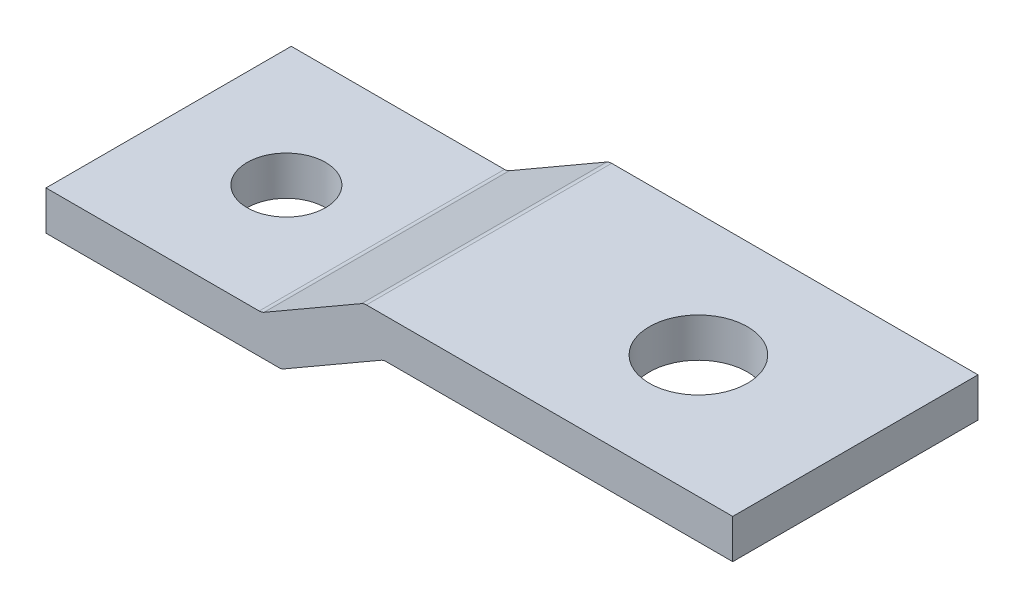
ISO-10303-21;
HEADER;
FILE_DESCRIPTION(('STEP AP214'),'2;1');
FILE_NAME('part.step','',(''),(''),'','','');
FILE_SCHEMA(('AUTOMOTIVE_DESIGN { 1 0 10303 214 1 1 1 1 }'));
ENDSEC;
DATA;
#1=APPLICATION_CONTEXT('core data for automotive mechanical design processes');
#2=APPLICATION_PROTOCOL_DEFINITION('international standard','automotive_design',2000,#1);
#3=PRODUCT_CONTEXT('',#1,'mechanical');
#4=PRODUCT('Part','Part','',(#3));
#5=PRODUCT_RELATED_PRODUCT_CATEGORY('part','',(#4));
#6=PRODUCT_DEFINITION_FORMATION('','',#4);
#7=PRODUCT_DEFINITION_CONTEXT('part definition',#1,'design');
#8=PRODUCT_DEFINITION('design','',#6,#7);
#9=PRODUCT_DEFINITION_SHAPE('','',#8);
#10=(LENGTH_UNIT() NAMED_UNIT(*) SI_UNIT(.MILLI.,.METRE.));
#11=(NAMED_UNIT(*) PLANE_ANGLE_UNIT() SI_UNIT($,.RADIAN.));
#12=(NAMED_UNIT(*) SI_UNIT($,.STERADIAN.) SOLID_ANGLE_UNIT());
#13=UNCERTAINTY_MEASURE_WITH_UNIT(LENGTH_MEASURE(1.E-05),#10,'distance_accuracy_value','');
#14=(GEOMETRIC_REPRESENTATION_CONTEXT(3) GLOBAL_UNCERTAINTY_ASSIGNED_CONTEXT((#13)) GLOBAL_UNIT_ASSIGNED_CONTEXT((#10,
#11,#12)) REPRESENTATION_CONTEXT('',''));
#15=CARTESIAN_POINT('',(0.,0.,0.));
#16=DIRECTION('',(0.,0.,1.));
#17=DIRECTION('',(1.,0.,0.));
#18=AXIS2_PLACEMENT_3D('',#15,#16,#17);
#19=CARTESIAN_POINT('',(0.,0.,25.));
#20=DIRECTION('',(1.,0.,0.));
#21=DIRECTION('',(0.,1.,0.));
#22=AXIS2_PLACEMENT_3D('',#19,#20,#21);
#23=PLANE('',#22);
#24=DIRECTION('',(0.,-1.,0.));
#25=VECTOR('',#24,1.);
#26=CARTESIAN_POINT('',(0.,0.,0.));
#27=LINE('',#26,#25);
#28=CARTESIAN_POINT('',(0.,0.,0.));
#29=VERTEX_POINT('',#28);
#30=CARTESIAN_POINT('',(0.,-4.00000000000001,0.));
#31=VERTEX_POINT('',#30);
#32=EDGE_CURVE('E129',#29,#31,#27,.T.);
#33=ORIENTED_EDGE('',*,*,#32,.T.);
#34=DIRECTION('',(0.,0.,-1.));
#35=VECTOR('',#34,1.);
#36=CARTESIAN_POINT('',(0.,-4.00000000000001,25.));
#37=LINE('',#36,#35);
#38=CARTESIAN_POINT('',(0.,-4.00000000000001,25.));
#39=VERTEX_POINT('',#38);
#40=EDGE_CURVE('E134',#39,#31,#37,.T.);
#41=ORIENTED_EDGE('',*,*,#40,.F.);
#42=DIRECTION('',(0.,-1.,0.));
#43=VECTOR('',#42,1.);
#44=CARTESIAN_POINT('',(0.,0.,25.));
#45=LINE('',#44,#43);
#46=CARTESIAN_POINT('',(0.,0.,25.));
#47=VERTEX_POINT('',#46);
#48=EDGE_CURVE('E166',#47,#39,#45,.T.);
#49=ORIENTED_EDGE('',*,*,#48,.F.);
#50=DIRECTION('',(0.,0.,-1.));
#51=VECTOR('',#50,1.);
#52=CARTESIAN_POINT('',(0.,0.,25.));
#53=LINE('',#52,#51);
#54=EDGE_CURVE('E145',#47,#29,#53,.T.);
#55=ORIENTED_EDGE('',*,*,#54,.T.);
#56=EDGE_LOOP('',(#33,#41,#49,#55));
#57=FACE_BOUND('',#56,.T.);
#58=ADVANCED_FACE('F35',(#57),#23,.F.);
#59=CARTESIAN_POINT('',(24.,-4.00000000000001,25.));
#60=DIRECTION('',(0.,1.,0.));
#61=DIRECTION('',(-1.,0.,0.));
#62=AXIS2_PLACEMENT_3D('',#59,#60,#61);
#63=PLANE('',#62);
#64=CARTESIAN_POINT('',(12.,-4.00000000000001,12.5));
#65=DIRECTION('',(0.,-1.,0.));
#66=DIRECTION('',(1.,0.,0.));
#67=AXIS2_PLACEMENT_3D('',#64,#65,#66);
#68=CIRCLE('',#67,4.);
#69=CARTESIAN_POINT('',(16.,-4.00000000000001,12.5));
#70=VERTEX_POINT('',#69);
#71=EDGE_CURVE('E148',#70,#70,#68,.T.);
#72=ORIENTED_EDGE('',*,*,#71,.F.);
#73=EDGE_LOOP('',(#72));
#74=FACE_BOUND('',#73,.T.);
#75=DIRECTION('',(1.,0.,0.));
#76=VECTOR('',#75,1.);
#77=CARTESIAN_POINT('',(24.,-4.00000000000001,0.));
#78=LINE('',#77,#76);
#79=CARTESIAN_POINT('',(23.7320508075689,-4.00000000000001,0.));
#80=VERTEX_POINT('',#79);
#81=EDGE_CURVE('E123',#31,#80,#78,.T.);
#82=ORIENTED_EDGE('',*,*,#81,.T.);
#83=DIRECTION('',(0.,0.,-1.));
#84=VECTOR('',#83,1.);
#85=CARTESIAN_POINT('',(23.7320508075689,-4.00000000000001,25.));
#86=LINE('',#85,#84);
#87=CARTESIAN_POINT('',(23.7320508075689,-4.00000000000001,25.));
#88=VERTEX_POINT('',#87);
#89=EDGE_CURVE('E56',#80,#88,#86,.F.);
#90=ORIENTED_EDGE('',*,*,#89,.T.);
#91=DIRECTION('',(1.,0.,0.));
#92=VECTOR('',#91,1.);
#93=CARTESIAN_POINT('',(24.,-4.00000000000001,25.));
#94=LINE('',#93,#92);
#95=EDGE_CURVE('E136',#39,#88,#94,.T.);
#96=ORIENTED_EDGE('',*,*,#95,.F.);
#97=ORIENTED_EDGE('',*,*,#40,.T.);
#98=EDGE_LOOP('',(#82,#90,#96,#97));
#99=FACE_BOUND('',#98,.T.);
#100=ADVANCED_FACE('F135',(#74,#99),#63,.F.);
#101=CARTESIAN_POINT('',(34.3923048454132,2.,25.));
#102=DIRECTION('',(-0.500000000000001,0.866025403784438,0.));
#103=DIRECTION('',(-0.866025403784438,-0.500000000000001,0.));
#104=AXIS2_PLACEMENT_3D('',#101,#102,#103);
#105=PLANE('',#104);
#106=DIRECTION('',(0.866025403784438,0.500000000000002,0.));
#107=VECTOR('',#106,1.);
#108=CARTESIAN_POINT('',(34.3923048454132,2.,25.));
#109=LINE('',#108,#107);
#110=CARTESIAN_POINT('',(24.2320508075689,-3.86602540378445,25.));
#111=VERTEX_POINT('',#110);
#112=CARTESIAN_POINT('',(34.1602540378444,1.86602540378443,25.));
#113=VERTEX_POINT('',#112);
#114=EDGE_CURVE('E169',#111,#113,#109,.T.);
#115=ORIENTED_EDGE('',*,*,#114,.F.);
#116=DIRECTION('',(0.,0.,-1.));
#117=VECTOR('',#116,1.);
#118=CARTESIAN_POINT('',(24.2320508075689,-3.86602540378445,25.));
#119=LINE('',#118,#117);
#120=CARTESIAN_POINT('',(24.2320508075689,-3.86602540378445,0.));
#121=VERTEX_POINT('',#120);
#122=EDGE_CURVE('E208',#111,#121,#119,.T.);
#123=ORIENTED_EDGE('',*,*,#122,.T.);
#124=DIRECTION('',(0.866025403784438,0.500000000000002,0.));
#125=VECTOR('',#124,1.);
#126=CARTESIAN_POINT('',(34.3923048454132,2.,0.));
#127=LINE('',#126,#125);
#128=CARTESIAN_POINT('',(34.1602540378444,1.86602540378443,0.));
#129=VERTEX_POINT('',#128);
#130=EDGE_CURVE('E131',#121,#129,#127,.T.);
#131=ORIENTED_EDGE('',*,*,#130,.T.);
#132=DIRECTION('',(0.,0.,-1.));
#133=VECTOR('',#132,1.);
#134=CARTESIAN_POINT('',(34.1602540378444,1.86602540378443,25.));
#135=LINE('',#134,#133);
#136=EDGE_CURVE('E206',#129,#113,#135,.F.);
#137=ORIENTED_EDGE('',*,*,#136,.T.);
#138=EDGE_LOOP('',(#115,#123,#131,#137));
#139=FACE_BOUND('',#138,.T.);
#140=ADVANCED_FACE('F225',(#139),#105,.F.);
#141=CARTESIAN_POINT('',(70.,2.,25.));
#142=DIRECTION('',(0.,1.,0.));
#143=DIRECTION('',(-1.,0.,0.));
#144=AXIS2_PLACEMENT_3D('',#141,#142,#143);
#145=PLANE('',#144);
#146=CARTESIAN_POINT('',(54.,2.,12.5));
#147=DIRECTION('',(0.,-1.,0.));
#148=DIRECTION('',(1.,0.,0.));
#149=AXIS2_PLACEMENT_3D('',#146,#147,#148);
#150=CIRCLE('',#149,5.);
#151=CARTESIAN_POINT('',(59.,2.,12.5));
#152=VERTEX_POINT('',#151);
#153=EDGE_CURVE('E363',#152,#152,#150,.T.);
#154=ORIENTED_EDGE('',*,*,#153,.F.);
#155=EDGE_LOOP('',(#154));
#156=FACE_BOUND('',#155,.T.);
#157=DIRECTION('',(1.,0.,0.));
#158=VECTOR('',#157,1.);
#159=CARTESIAN_POINT('',(70.,2.,25.));
#160=LINE('',#159,#158);
#161=CARTESIAN_POINT('',(34.6602540378444,2.,25.));
#162=VERTEX_POINT('',#161);
#163=CARTESIAN_POINT('',(70.,2.,25.));
#164=VERTEX_POINT('',#163);
#165=EDGE_CURVE('E171',#162,#164,#160,.T.);
#166=ORIENTED_EDGE('',*,*,#165,.F.);
#167=DIRECTION('',(0.,0.,-1.));
#168=VECTOR('',#167,1.);
#169=CARTESIAN_POINT('',(34.6602540378444,2.,0.));
#170=LINE('',#169,#168);
#171=CARTESIAN_POINT('',(34.6602540378444,2.,0.));
#172=VERTEX_POINT('',#171);
#173=EDGE_CURVE('E215',#162,#172,#170,.T.);
#174=ORIENTED_EDGE('',*,*,#173,.T.);
#175=DIRECTION('',(1.,0.,0.));
#176=VECTOR('',#175,1.);
#177=CARTESIAN_POINT('',(70.,2.,0.));
#178=LINE('',#177,#176);
#179=CARTESIAN_POINT('',(70.,2.,0.));
#180=VERTEX_POINT('',#179);
#181=EDGE_CURVE('E154',#172,#180,#178,.T.);
#182=ORIENTED_EDGE('',*,*,#181,.T.);
#183=DIRECTION('',(0.,0.,-1.));
#184=VECTOR('',#183,1.);
#185=CARTESIAN_POINT('',(70.,2.,25.));
#186=LINE('',#185,#184);
#187=EDGE_CURVE('E141',#164,#180,#186,.T.);
#188=ORIENTED_EDGE('',*,*,#187,.F.);
#189=EDGE_LOOP('',(#166,#174,#182,#188));
#190=FACE_BOUND('',#189,.T.);
#191=ADVANCED_FACE('F229',(#156,#190),#145,.F.);
#192=CARTESIAN_POINT('',(70.,6.,25.));
#193=DIRECTION('',(-1.,0.,0.));
#194=DIRECTION('',(0.,0.,1.));
#195=AXIS2_PLACEMENT_3D('',#192,#193,#194);
#196=PLANE('',#195);
#197=DIRECTION('',(0.,1.,0.));
#198=VECTOR('',#197,1.);
#199=CARTESIAN_POINT('',(70.,6.,0.));
#200=LINE('',#199,#198);
#201=CARTESIAN_POINT('',(70.,6.,0.));
#202=VERTEX_POINT('',#201);
#203=EDGE_CURVE('E156',#180,#202,#200,.T.);
#204=ORIENTED_EDGE('',*,*,#203,.T.);
#205=DIRECTION('',(0.,0.,-1.));
#206=VECTOR('',#205,1.);
#207=CARTESIAN_POINT('',(70.,6.,25.));
#208=LINE('',#207,#206);
#209=CARTESIAN_POINT('',(70.,6.,25.));
#210=VERTEX_POINT('',#209);
#211=EDGE_CURVE('E184',#210,#202,#208,.T.);
#212=ORIENTED_EDGE('',*,*,#211,.F.);
#213=DIRECTION('',(0.,1.,0.));
#214=VECTOR('',#213,1.);
#215=CARTESIAN_POINT('',(70.,6.,25.));
#216=LINE('',#215,#214);
#217=EDGE_CURVE('E173',#164,#210,#216,.T.);
#218=ORIENTED_EDGE('',*,*,#217,.F.);
#219=ORIENTED_EDGE('',*,*,#187,.T.);
#220=EDGE_LOOP('',(#204,#212,#218,#219));
#221=FACE_BOUND('',#220,.T.);
#222=ADVANCED_FACE('F237',(#221),#196,.F.);
#223=CARTESIAN_POINT('',(32.3923048454132,6.,25.));
#224=DIRECTION('',(0.,-1.,0.));
#225=DIRECTION('',(1.,0.,0.));
#226=AXIS2_PLACEMENT_3D('',#223,#224,#225);
#227=PLANE('',#226);
#228=CARTESIAN_POINT('',(54.,6.,12.5));
#229=DIRECTION('',(0.,-1.,0.));
#230=DIRECTION('',(1.,0.,0.));
#231=AXIS2_PLACEMENT_3D('',#228,#229,#230);
#232=CIRCLE('',#231,5.);
#233=CARTESIAN_POINT('',(59.,6.,12.5));
#234=VERTEX_POINT('',#233);
#235=EDGE_CURVE('E360',#234,#234,#232,.T.);
#236=ORIENTED_EDGE('',*,*,#235,.T.);
#237=EDGE_LOOP('',(#236));
#238=FACE_BOUND('',#237,.T.);
#239=DIRECTION('',(-1.,0.,0.));
#240=VECTOR('',#239,1.);
#241=CARTESIAN_POINT('',(32.3923048454132,6.,0.));
#242=LINE('',#241,#240);
#243=CARTESIAN_POINT('',(32.6602540378443,6.,0.));
#244=VERTEX_POINT('',#243);
#245=EDGE_CURVE('E158',#202,#244,#242,.T.);
#246=ORIENTED_EDGE('',*,*,#245,.T.);
#247=DIRECTION('',(0.,0.,-1.));
#248=VECTOR('',#247,1.);
#249=CARTESIAN_POINT('',(32.6602540378443,6.,25.));
#250=LINE('',#249,#248);
#251=CARTESIAN_POINT('',(32.6602540378443,6.,25.));
#252=VERTEX_POINT('',#251);
#253=EDGE_CURVE('E198',#244,#252,#250,.F.);
#254=ORIENTED_EDGE('',*,*,#253,.T.);
#255=DIRECTION('',(-1.,0.,0.));
#256=VECTOR('',#255,1.);
#257=CARTESIAN_POINT('',(32.3923048454132,6.,25.));
#258=LINE('',#257,#256);
#259=EDGE_CURVE('E175',#210,#252,#258,.T.);
#260=ORIENTED_EDGE('',*,*,#259,.F.);
#261=ORIENTED_EDGE('',*,*,#211,.T.);
#262=EDGE_LOOP('',(#246,#254,#260,#261));
#263=FACE_BOUND('',#262,.T.);
#264=ADVANCED_FACE('F240',(#238,#263),#227,.F.);
#265=CARTESIAN_POINT('',(22.,0.,25.));
#266=DIRECTION('',(0.500000000000002,-0.866025403784438,0.));
#267=DIRECTION('',(0.866025403784438,0.500000000000002,0.));
#268=AXIS2_PLACEMENT_3D('',#265,#266,#267);
#269=PLANE('',#268);
#270=DIRECTION('',(-0.866025403784438,-0.500000000000002,0.));
#271=VECTOR('',#270,1.);
#272=CARTESIAN_POINT('',(22.,0.,0.));
#273=LINE('',#272,#271);
#274=CARTESIAN_POINT('',(32.1602540378443,5.86602540378444,0.));
#275=VERTEX_POINT('',#274);
#276=CARTESIAN_POINT('',(22.2320508075689,0.133974596215562,0.));
#277=VERTEX_POINT('',#276);
#278=EDGE_CURVE('E161',#275,#277,#273,.T.);
#279=ORIENTED_EDGE('',*,*,#278,.T.);
#280=DIRECTION('',(0.,0.,-1.));
#281=VECTOR('',#280,1.);
#282=CARTESIAN_POINT('',(22.2320508075689,0.133974596215562,25.));
#283=LINE('',#282,#281);
#284=CARTESIAN_POINT('',(22.2320508075689,0.133974596215562,25.));
#285=VERTEX_POINT('',#284);
#286=EDGE_CURVE('E194',#277,#285,#283,.F.);
#287=ORIENTED_EDGE('',*,*,#286,.T.);
#288=DIRECTION('',(-0.866025403784438,-0.500000000000002,0.));
#289=VECTOR('',#288,1.);
#290=CARTESIAN_POINT('',(22.,0.,25.));
#291=LINE('',#290,#289);
#292=CARTESIAN_POINT('',(32.1602540378443,5.86602540378444,25.));
#293=VERTEX_POINT('',#292);
#294=EDGE_CURVE('E178',#293,#285,#291,.T.);
#295=ORIENTED_EDGE('',*,*,#294,.F.);
#296=DIRECTION('',(0.,0.,-1.));
#297=VECTOR('',#296,1.);
#298=CARTESIAN_POINT('',(32.1602540378443,5.86602540378444,25.));
#299=LINE('',#298,#297);
#300=EDGE_CURVE('E191',#293,#275,#299,.T.);
#301=ORIENTED_EDGE('',*,*,#300,.T.);
#302=EDGE_LOOP('',(#279,#287,#295,#301));
#303=FACE_BOUND('',#302,.T.);
#304=ADVANCED_FACE('F248',(#303),#269,.F.);
#305=CARTESIAN_POINT('',(0.,0.,25.));
#306=DIRECTION('',(0.,-1.,0.));
#307=DIRECTION('',(0.,0.,-1.));
#308=AXIS2_PLACEMENT_3D('',#305,#306,#307);
#309=PLANE('',#308);
#310=CARTESIAN_POINT('',(12.,0.,12.5));
#311=DIRECTION('',(0.,-1.,0.));
#312=DIRECTION('',(0.,0.,-1.));
#313=AXIS2_PLACEMENT_3D('',#310,#311,#312);
#314=CIRCLE('',#313,4.);
#315=CARTESIAN_POINT('',(12.,0.,8.5));
#316=VERTEX_POINT('',#315);
#317=EDGE_CURVE('E38',#316,#316,#314,.T.);
#318=ORIENTED_EDGE('',*,*,#317,.T.);
#319=EDGE_LOOP('',(#318));
#320=FACE_BOUND('',#319,.T.);
#321=DIRECTION('',(-1.,0.,0.));
#322=VECTOR('',#321,1.);
#323=CARTESIAN_POINT('',(0.,0.,25.));
#324=LINE('',#323,#322);
#325=CARTESIAN_POINT('',(21.7320508075689,0.,25.));
#326=VERTEX_POINT('',#325);
#327=EDGE_CURVE('E181',#326,#47,#324,.T.);
#328=ORIENTED_EDGE('',*,*,#327,.F.);
#329=DIRECTION('',(0.,0.,-1.));
#330=VECTOR('',#329,1.);
#331=CARTESIAN_POINT('',(21.7320508075689,0.,0.));
#332=LINE('',#331,#330);
#333=CARTESIAN_POINT('',(21.7320508075689,0.,0.));
#334=VERTEX_POINT('',#333);
#335=EDGE_CURVE('E140',#326,#334,#332,.T.);
#336=ORIENTED_EDGE('',*,*,#335,.T.);
#337=DIRECTION('',(-1.,0.,0.));
#338=VECTOR('',#337,1.);
#339=CARTESIAN_POINT('',(0.,0.,0.));
#340=LINE('',#339,#338);
#341=EDGE_CURVE('E164',#334,#29,#340,.T.);
#342=ORIENTED_EDGE('',*,*,#341,.T.);
#343=ORIENTED_EDGE('',*,*,#54,.F.);
#344=EDGE_LOOP('',(#328,#336,#342,#343));
#345=FACE_BOUND('',#344,.T.);
#346=ADVANCED_FACE('F256',(#320,#345),#309,.F.);
#347=CARTESIAN_POINT('',(0.,-4.00000000000001,25.));
#348=DIRECTION('',(0.,0.,-1.));
#349=DIRECTION('',(-1.,0.,0.));
#350=AXIS2_PLACEMENT_3D('',#347,#348,#349);
#351=PLANE('',#350);
#352=ORIENTED_EDGE('',*,*,#95,.T.);
#353=CARTESIAN_POINT('',(23.7320508075689,-3.00000000000001,25.));
#354=DIRECTION('',(0.,0.,-1.));
#355=DIRECTION('',(-1.,0.,0.));
#356=AXIS2_PLACEMENT_3D('',#353,#354,#355);
#357=CIRCLE('',#356,1.);
#358=EDGE_CURVE('E213',#88,#111,#357,.F.);
#359=ORIENTED_EDGE('',*,*,#358,.T.);
#360=ORIENTED_EDGE('',*,*,#114,.T.);
#361=CARTESIAN_POINT('',(34.6602540378444,0.999999999999997,25.));
#362=DIRECTION('',(0.,0.,-1.));
#363=DIRECTION('',(-1.,0.,0.));
#364=AXIS2_PLACEMENT_3D('',#361,#362,#363);
#365=CIRCLE('',#364,1.);
#366=EDGE_CURVE('E11',#113,#162,#365,.T.);
#367=ORIENTED_EDGE('',*,*,#366,.T.);
#368=ORIENTED_EDGE('',*,*,#165,.T.);
#369=ORIENTED_EDGE('',*,*,#217,.T.);
#370=ORIENTED_EDGE('',*,*,#259,.T.);
#371=CARTESIAN_POINT('',(32.6602540378443,5.,25.));
#372=DIRECTION('',(0.,0.,-1.));
#373=DIRECTION('',(-1.,0.,0.));
#374=AXIS2_PLACEMENT_3D('',#371,#372,#373);
#375=CIRCLE('',#374,1.);
#376=EDGE_CURVE('E200',#252,#293,#375,.F.);
#377=ORIENTED_EDGE('',*,*,#376,.T.);
#378=ORIENTED_EDGE('',*,*,#294,.T.);
#379=CARTESIAN_POINT('',(21.7320508075689,1.,25.));
#380=DIRECTION('',(0.,0.,-1.));
#381=DIRECTION('',(-1.,0.,0.));
#382=AXIS2_PLACEMENT_3D('',#379,#380,#381);
#383=CIRCLE('',#382,1.);
#384=EDGE_CURVE('E204',#285,#326,#383,.T.);
#385=ORIENTED_EDGE('',*,*,#384,.T.);
#386=ORIENTED_EDGE('',*,*,#327,.T.);
#387=ORIENTED_EDGE('',*,*,#48,.T.);
#388=EDGE_LOOP('',(#352,#359,#360,#367,#368,#369,#370,#377,#378,#385,#386,#387));
#389=FACE_BOUND('',#388,.T.);
#390=ADVANCED_FACE('F232',(#389),#351,.F.);
#391=CARTESIAN_POINT('',(0.,-4.00000000000001,0.));
#392=DIRECTION('',(0.,0.,-1.));
#393=DIRECTION('',(-1.,0.,0.));
#394=AXIS2_PLACEMENT_3D('',#391,#392,#393);
#395=PLANE('',#394);
#396=ORIENTED_EDGE('',*,*,#130,.F.);
#397=CARTESIAN_POINT('',(23.7320508075689,-3.00000000000001,0.));
#398=DIRECTION('',(0.,0.,-1.));
#399=DIRECTION('',(-1.,0.,0.));
#400=AXIS2_PLACEMENT_3D('',#397,#398,#399);
#401=CIRCLE('',#400,1.);
#402=EDGE_CURVE('E130',#121,#80,#401,.T.);
#403=ORIENTED_EDGE('',*,*,#402,.T.);
#404=ORIENTED_EDGE('',*,*,#81,.F.);
#405=ORIENTED_EDGE('',*,*,#32,.F.);
#406=ORIENTED_EDGE('',*,*,#341,.F.);
#407=CARTESIAN_POINT('',(21.7320508075689,1.,0.));
#408=DIRECTION('',(0.,0.,-1.));
#409=DIRECTION('',(-1.,0.,0.));
#410=AXIS2_PLACEMENT_3D('',#407,#408,#409);
#411=CIRCLE('',#410,1.);
#412=EDGE_CURVE('E202',#334,#277,#411,.F.);
#413=ORIENTED_EDGE('',*,*,#412,.T.);
#414=ORIENTED_EDGE('',*,*,#278,.F.);
#415=CARTESIAN_POINT('',(32.6602540378443,5.,0.));
#416=DIRECTION('',(0.,0.,-1.));
#417=DIRECTION('',(-1.,0.,0.));
#418=AXIS2_PLACEMENT_3D('',#415,#416,#417);
#419=CIRCLE('',#418,1.);
#420=EDGE_CURVE('E196',#275,#244,#419,.T.);
#421=ORIENTED_EDGE('',*,*,#420,.T.);
#422=ORIENTED_EDGE('',*,*,#245,.F.);
#423=ORIENTED_EDGE('',*,*,#203,.F.);
#424=ORIENTED_EDGE('',*,*,#181,.F.);
#425=CARTESIAN_POINT('',(34.6602540378444,0.999999999999997,0.));
#426=DIRECTION('',(0.,0.,-1.));
#427=DIRECTION('',(-1.,0.,0.));
#428=AXIS2_PLACEMENT_3D('',#425,#426,#427);
#429=CIRCLE('',#428,1.);
#430=EDGE_CURVE('E43',#172,#129,#429,.F.);
#431=ORIENTED_EDGE('',*,*,#430,.T.);
#432=EDGE_LOOP('',(#396,#403,#404,#405,#406,#413,#414,#421,#422,#423,#424,#431));
#433=FACE_BOUND('',#432,.T.);
#434=ADVANCED_FACE('F126',(#433),#395,.T.);
#435=CARTESIAN_POINT('',(21.7320508075689,1.,25.));
#436=DIRECTION('',(0.,0.,1.));
#437=DIRECTION('',(1.,0.,0.));
#438=AXIS2_PLACEMENT_3D('',#435,#436,#437);
#439=CYLINDRICAL_SURFACE('',#438,1.);
#440=ORIENTED_EDGE('',*,*,#384,.F.);
#441=ORIENTED_EDGE('',*,*,#286,.F.);
#442=ORIENTED_EDGE('',*,*,#412,.F.);
#443=ORIENTED_EDGE('',*,*,#335,.F.);
#444=EDGE_LOOP('',(#440,#441,#442,#443));
#445=FACE_BOUND('',#444,.T.);
#446=ADVANCED_FACE('F252',(#445),#439,.F.);
#447=CARTESIAN_POINT('',(32.6602540378443,5.,25.));
#448=DIRECTION('',(0.,0.,-1.));
#449=DIRECTION('',(-1.,0.,0.));
#450=AXIS2_PLACEMENT_3D('',#447,#448,#449);
#451=CYLINDRICAL_SURFACE('',#450,1.);
#452=ORIENTED_EDGE('',*,*,#376,.F.);
#453=ORIENTED_EDGE('',*,*,#253,.F.);
#454=ORIENTED_EDGE('',*,*,#420,.F.);
#455=ORIENTED_EDGE('',*,*,#300,.F.);
#456=EDGE_LOOP('',(#452,#453,#454,#455));
#457=FACE_BOUND('',#456,.T.);
#458=ADVANCED_FACE('F243',(#457),#451,.T.);
#459=CARTESIAN_POINT('',(23.7320508075689,-3.00000000000001,25.));
#460=DIRECTION('',(0.,0.,-1.));
#461=DIRECTION('',(-1.,0.,0.));
#462=AXIS2_PLACEMENT_3D('',#459,#460,#461);
#463=CYLINDRICAL_SURFACE('',#462,1.);
#464=ORIENTED_EDGE('',*,*,#358,.F.);
#465=ORIENTED_EDGE('',*,*,#89,.F.);
#466=ORIENTED_EDGE('',*,*,#402,.F.);
#467=ORIENTED_EDGE('',*,*,#122,.F.);
#468=EDGE_LOOP('',(#464,#465,#466,#467));
#469=FACE_BOUND('',#468,.T.);
#470=ADVANCED_FACE('F259',(#469),#463,.T.);
#471=CARTESIAN_POINT('',(34.6602540378444,0.999999999999997,25.));
#472=DIRECTION('',(0.,0.,1.));
#473=DIRECTION('',(1.,0.,0.));
#474=AXIS2_PLACEMENT_3D('',#471,#472,#473);
#475=CYLINDRICAL_SURFACE('',#474,1.);
#476=ORIENTED_EDGE('',*,*,#366,.F.);
#477=ORIENTED_EDGE('',*,*,#136,.F.);
#478=ORIENTED_EDGE('',*,*,#430,.F.);
#479=ORIENTED_EDGE('',*,*,#173,.F.);
#480=EDGE_LOOP('',(#476,#477,#478,#479));
#481=FACE_BOUND('',#480,.T.);
#482=ADVANCED_FACE('F227',(#481),#475,.F.);
#483=CARTESIAN_POINT('',(12.,21.,12.5));
#484=DIRECTION('',(0.,-1.,0.));
#485=DIRECTION('',(1.,0.,0.));
#486=AXIS2_PLACEMENT_3D('',#483,#484,#485);
#487=CYLINDRICAL_SURFACE('',#486,4.);
#488=ORIENTED_EDGE('',*,*,#71,.T.);
#489=EDGE_LOOP('',(#488));
#490=FACE_BOUND('',#489,.T.);
#491=ORIENTED_EDGE('',*,*,#317,.F.);
#492=EDGE_LOOP('',(#491));
#493=FACE_BOUND('',#492,.T.);
#494=ADVANCED_FACE('F266',(#490,#493),#487,.F.);
#495=CARTESIAN_POINT('',(54.,6.,12.5));
#496=DIRECTION('',(0.,-1.,0.));
#497=DIRECTION('',(1.,0.,0.));
#498=AXIS2_PLACEMENT_3D('',#495,#496,#497);
#499=CYLINDRICAL_SURFACE('',#498,5.);
#500=ORIENTED_EDGE('',*,*,#235,.F.);
#501=EDGE_LOOP('',(#500));
#502=FACE_BOUND('',#501,.T.);
#503=ORIENTED_EDGE('',*,*,#153,.T.);
#504=EDGE_LOOP('',(#503));
#505=FACE_BOUND('',#504,.T.);
#506=ADVANCED_FACE('F326',(#502,#505),#499,.F.);
#507=CLOSED_SHELL('',(#58,#100,#140,#191,#222,#264,#304,#346,#390,#434,#446,#458,#470,#482,#494,#506));
#508=MANIFOLD_SOLID_BREP('B2',#507);
#509=ADVANCED_BREP_SHAPE_REPRESENTATION('',(#18,#508),#14);
#510=SHAPE_DEFINITION_REPRESENTATION(#9,#509);
ENDSEC;
END-ISO-10303-21;
